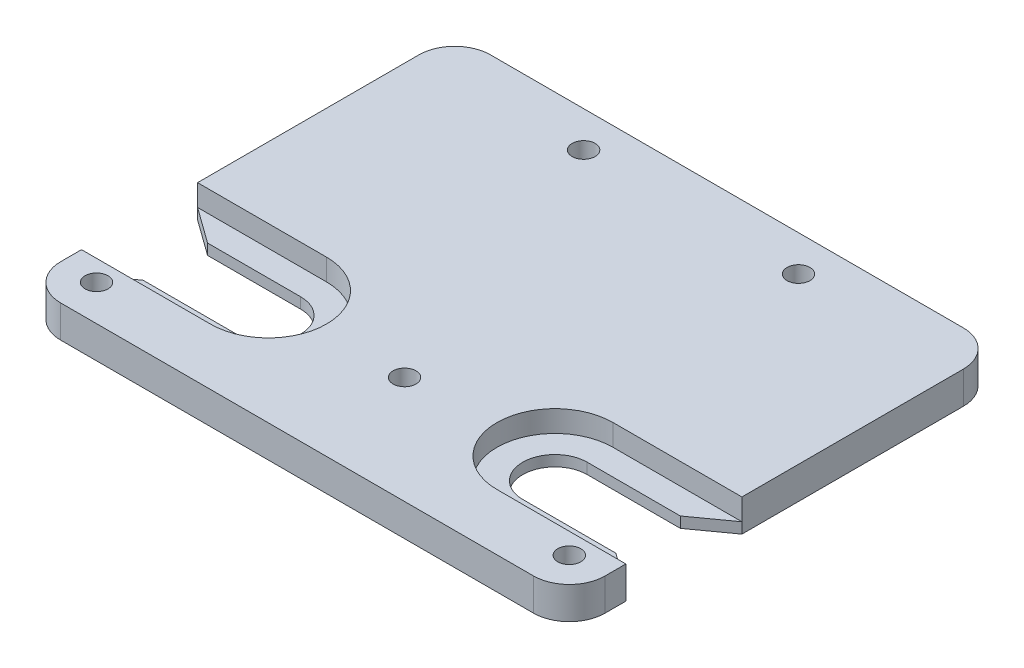
ISO-10303-21;
HEADER;
FILE_DESCRIPTION(('STEP AP214'),'2;1');
FILE_NAME('part.step','',(''),(''),'','','');
FILE_SCHEMA(('AUTOMOTIVE_DESIGN { 1 0 10303 214 1 1 1 1 }'));
ENDSEC;
DATA;
#1=APPLICATION_CONTEXT('core data for automotive mechanical design processes');
#2=APPLICATION_PROTOCOL_DEFINITION('international standard','automotive_design',2000,#1);
#3=PRODUCT_CONTEXT('',#1,'mechanical');
#4=PRODUCT('Part','Part','',(#3));
#5=PRODUCT_RELATED_PRODUCT_CATEGORY('part','',(#4));
#6=PRODUCT_DEFINITION_FORMATION('','',#4);
#7=PRODUCT_DEFINITION_CONTEXT('part definition',#1,'design');
#8=PRODUCT_DEFINITION('design','',#6,#7);
#9=PRODUCT_DEFINITION_SHAPE('','',#8);
#10=(LENGTH_UNIT() NAMED_UNIT(*) SI_UNIT(.MILLI.,.METRE.));
#11=(NAMED_UNIT(*) PLANE_ANGLE_UNIT() SI_UNIT($,.RADIAN.));
#12=(NAMED_UNIT(*) SI_UNIT($,.STERADIAN.) SOLID_ANGLE_UNIT());
#13=UNCERTAINTY_MEASURE_WITH_UNIT(LENGTH_MEASURE(1.E-05),#10,'distance_accuracy_value','');
#14=(GEOMETRIC_REPRESENTATION_CONTEXT(3) GLOBAL_UNCERTAINTY_ASSIGNED_CONTEXT((#13)) GLOBAL_UNIT_ASSIGNED_CONTEXT((#10,
#11,#12)) REPRESENTATION_CONTEXT('',''));
#15=CARTESIAN_POINT('',(0.,0.,0.));
#16=DIRECTION('',(0.,0.,1.));
#17=DIRECTION('',(1.,0.,0.));
#18=AXIS2_PLACEMENT_3D('',#15,#16,#17);
#19=CARTESIAN_POINT('',(-38.,4.5,30.));
#20=DIRECTION('',(1.,0.,0.));
#21=DIRECTION('',(0.,0.,-1.));
#22=AXIS2_PLACEMENT_3D('',#19,#20,#21);
#23=PLANE('',#22);
#24=DIRECTION('',(0.,0.,1.));
#25=VECTOR('',#24,1.);
#26=CARTESIAN_POINT('',(-38.,0.,30.));
#27=LINE('',#26,#25);
#28=CARTESIAN_POINT('',(-38.,0.,22.1));
#29=VERTEX_POINT('',#28);
#30=CARTESIAN_POINT('',(-38.,0.,25.));
#31=VERTEX_POINT('',#30);
#32=EDGE_CURVE('E384',#29,#31,#27,.T.);
#33=ORIENTED_EDGE('',*,*,#32,.T.);
#34=DIRECTION('',(0.,-1.,0.));
#35=VECTOR('',#34,1.);
#36=CARTESIAN_POINT('',(-38.,4.5,25.));
#37=LINE('',#36,#35);
#38=CARTESIAN_POINT('',(-38.,4.5,25.));
#39=VERTEX_POINT('',#38);
#40=EDGE_CURVE('E43',#31,#39,#37,.F.);
#41=ORIENTED_EDGE('',*,*,#40,.T.);
#42=DIRECTION('',(0.,0.,1.));
#43=VECTOR('',#42,1.);
#44=CARTESIAN_POINT('',(-38.,4.5,30.));
#45=LINE('',#44,#43);
#46=CARTESIAN_POINT('',(-38.,4.5,22.1));
#47=VERTEX_POINT('',#46);
#48=EDGE_CURVE('E373',#47,#39,#45,.T.);
#49=ORIENTED_EDGE('',*,*,#48,.F.);
#50=DIRECTION('',(0.,1.,0.));
#51=VECTOR('',#50,1.);
#52=CARTESIAN_POINT('',(-38.,-30.7188866985768,22.1));
#53=LINE('',#52,#51);
#54=CARTESIAN_POINT('',(-38.,1.5,22.1));
#55=VERTEX_POINT('',#54);
#56=EDGE_CURVE('E273',#55,#47,#53,.T.);
#57=ORIENTED_EDGE('',*,*,#56,.F.);
#58=DIRECTION('',(0.,1.,0.));
#59=VECTOR('',#58,1.);
#60=CARTESIAN_POINT('',(-38.,0.,22.1));
#61=LINE('',#60,#59);
#62=EDGE_CURVE('E264',#29,#55,#61,.T.);
#63=ORIENTED_EDGE('',*,*,#62,.F.);
#64=EDGE_LOOP('',(#33,#41,#49,#57,#63));
#65=FACE_BOUND('',#64,.T.);
#66=ADVANCED_FACE('F35',(#65),#23,.F.);
#67=CARTESIAN_POINT('',(-38.,4.5,-25.));
#68=VERTEX_POINT('',#67);
#69=CARTESIAN_POINT('',(-38.,4.5,5.90000000000001));
#70=VERTEX_POINT('',#69);
#71=EDGE_CURVE('E374',#68,#70,#45,.T.);
#72=ORIENTED_EDGE('',*,*,#71,.F.);
#73=DIRECTION('',(0.,-1.,0.));
#74=VECTOR('',#73,1.);
#75=CARTESIAN_POINT('',(-38.,4.5,-25.));
#76=LINE('',#75,#74);
#77=CARTESIAN_POINT('',(-38.,0.,-25.));
#78=VERTEX_POINT('',#77);
#79=EDGE_CURVE('E378',#68,#78,#76,.T.);
#80=ORIENTED_EDGE('',*,*,#79,.T.);
#81=CARTESIAN_POINT('',(-38.,0.,5.90000000000001));
#82=VERTEX_POINT('',#81);
#83=EDGE_CURVE('E385',#78,#82,#27,.T.);
#84=ORIENTED_EDGE('',*,*,#83,.T.);
#85=DIRECTION('',(0.,1.,0.));
#86=VECTOR('',#85,1.);
#87=CARTESIAN_POINT('',(-38.,0.,5.90000000000001));
#88=LINE('',#87,#86);
#89=CARTESIAN_POINT('',(-38.,1.5,5.90000000000001));
#90=VERTEX_POINT('',#89);
#91=EDGE_CURVE('E266',#82,#90,#88,.T.);
#92=ORIENTED_EDGE('',*,*,#91,.T.);
#93=DIRECTION('',(0.,1.,0.));
#94=VECTOR('',#93,1.);
#95=CARTESIAN_POINT('',(-38.,-30.7188866985768,5.90000000000001));
#96=LINE('',#95,#94);
#97=EDGE_CURVE('E279',#90,#70,#96,.T.);
#98=ORIENTED_EDGE('',*,*,#97,.T.);
#99=EDGE_LOOP('',(#72,#80,#84,#92,#98));
#100=FACE_BOUND('',#99,.T.);
#101=ADVANCED_FACE('F483',(#100),#23,.F.);
#102=CARTESIAN_POINT('',(0.,0.,0.));
#103=DIRECTION('',(0.,-1.,0.));
#104=DIRECTION('',(0.,0.,-1.));
#105=AXIS2_PLACEMENT_3D('',#102,#103,#104);
#106=PLANE('',#105);
#107=CARTESIAN_POINT('',(0.,0.,15.));
#108=DIRECTION('',(0.,1.,0.));
#109=DIRECTION('',(0.,0.,1.));
#110=AXIS2_PLACEMENT_3D('',#107,#108,#109);
#111=CIRCLE('',#110,1.6);
#112=CARTESIAN_POINT('',(0.,0.,16.6));
#113=VERTEX_POINT('',#112);
#114=EDGE_CURVE('E562',#113,#113,#111,.T.);
#115=ORIENTED_EDGE('',*,*,#114,.T.);
#116=EDGE_LOOP('',(#115));
#117=FACE_BOUND('',#116,.T.);
#118=CARTESIAN_POINT('',(-33.,0.,25.));
#119=DIRECTION('',(0.,1.,0.));
#120=DIRECTION('',(0.,0.,1.));
#121=AXIS2_PLACEMENT_3D('',#118,#119,#120);
#122=CIRCLE('',#121,1.6);
#123=CARTESIAN_POINT('',(-33.,0.,26.6));
#124=VERTEX_POINT('',#123);
#125=EDGE_CURVE('E571',#124,#124,#122,.T.);
#126=ORIENTED_EDGE('',*,*,#125,.T.);
#127=EDGE_LOOP('',(#126));
#128=FACE_BOUND('',#127,.T.);
#129=CARTESIAN_POINT('',(33.,0.,25.));
#130=DIRECTION('',(0.,1.,0.));
#131=DIRECTION('',(0.,0.,1.));
#132=AXIS2_PLACEMENT_3D('',#129,#130,#131);
#133=CIRCLE('',#132,1.6);
#134=CARTESIAN_POINT('',(33.,0.,26.6));
#135=VERTEX_POINT('',#134);
#136=EDGE_CURVE('E577',#135,#135,#133,.T.);
#137=ORIENTED_EDGE('',*,*,#136,.T.);
#138=EDGE_LOOP('',(#137));
#139=FACE_BOUND('',#138,.T.);
#140=CARTESIAN_POINT('',(15.,0.,-25.));
#141=DIRECTION('',(0.,1.,0.));
#142=DIRECTION('',(0.,0.,1.));
#143=AXIS2_PLACEMENT_3D('',#140,#141,#142);
#144=CIRCLE('',#143,1.6);
#145=CARTESIAN_POINT('',(15.,0.,-23.4));
#146=VERTEX_POINT('',#145);
#147=EDGE_CURVE('E583',#146,#146,#144,.T.);
#148=ORIENTED_EDGE('',*,*,#147,.T.);
#149=EDGE_LOOP('',(#148));
#150=FACE_BOUND('',#149,.T.);
#151=CARTESIAN_POINT('',(-15.,0.,-25.));
#152=DIRECTION('',(0.,1.,0.));
#153=DIRECTION('',(0.,0.,1.));
#154=AXIS2_PLACEMENT_3D('',#151,#152,#153);
#155=CIRCLE('',#154,1.6);
#156=CARTESIAN_POINT('',(-15.,0.,-23.4));
#157=VERTEX_POINT('',#156);
#158=EDGE_CURVE('E252',#157,#157,#155,.T.);
#159=ORIENTED_EDGE('',*,*,#158,.T.);
#160=EDGE_LOOP('',(#159));
#161=FACE_BOUND('',#160,.T.);
#162=ORIENTED_EDGE('',*,*,#83,.F.);
#163=CARTESIAN_POINT('',(-33.,0.,-25.));
#164=DIRECTION('',(0.,-1.,0.));
#165=DIRECTION('',(0.,0.,-1.));
#166=AXIS2_PLACEMENT_3D('',#163,#164,#165);
#167=CIRCLE('',#166,5.);
#168=CARTESIAN_POINT('',(-33.,0.,-30.));
#169=VERTEX_POINT('',#168);
#170=EDGE_CURVE('E398',#78,#169,#167,.T.);
#171=ORIENTED_EDGE('',*,*,#170,.T.);
#172=DIRECTION('',(-1.,0.,0.));
#173=VECTOR('',#172,1.);
#174=CARTESIAN_POINT('',(-38.,0.,-30.));
#175=LINE('',#174,#173);
#176=CARTESIAN_POINT('',(33.,0.,-30.));
#177=VERTEX_POINT('',#176);
#178=EDGE_CURVE('E381',#177,#169,#175,.T.);
#179=ORIENTED_EDGE('',*,*,#178,.F.);
#180=CARTESIAN_POINT('',(33.,0.,-25.));
#181=DIRECTION('',(0.,-1.,0.));
#182=DIRECTION('',(0.,0.,-1.));
#183=AXIS2_PLACEMENT_3D('',#180,#181,#182);
#184=CIRCLE('',#183,5.);
#185=CARTESIAN_POINT('',(38.,0.,-25.));
#186=VERTEX_POINT('',#185);
#187=EDGE_CURVE('E396',#177,#186,#184,.T.);
#188=ORIENTED_EDGE('',*,*,#187,.T.);
#189=DIRECTION('',(0.,0.,-1.));
#190=VECTOR('',#189,1.);
#191=CARTESIAN_POINT('',(38.,0.,30.));
#192=LINE('',#191,#190);
#193=CARTESIAN_POINT('',(38.,0.,5.90000000000001));
#194=VERTEX_POINT('',#193);
#195=EDGE_CURVE('E366',#194,#186,#192,.T.);
#196=ORIENTED_EDGE('',*,*,#195,.F.);
#197=DIRECTION('',(-0.811534341451494,0.,0.584304725845076));
#198=VECTOR('',#197,1.);
#199=CARTESIAN_POINT('',(33.,0.,9.50000000000001));
#200=LINE('',#199,#198);
#201=CARTESIAN_POINT('',(33.,0.,9.50000000000001));
#202=VERTEX_POINT('',#201);
#203=EDGE_CURVE('E308',#194,#202,#200,.T.);
#204=ORIENTED_EDGE('',*,*,#203,.T.);
#205=DIRECTION('',(-1.,0.,0.));
#206=VECTOR('',#205,1.);
#207=CARTESIAN_POINT('',(20.,0.,9.50000000000001));
#208=LINE('',#207,#206);
#209=CARTESIAN_POINT('',(20.,0.,9.50000000000001));
#210=VERTEX_POINT('',#209);
#211=EDGE_CURVE('E311',#202,#210,#208,.T.);
#212=ORIENTED_EDGE('',*,*,#211,.T.);
#213=CARTESIAN_POINT('',(20.,0.,14.));
#214=DIRECTION('',(0.,1.,0.));
#215=DIRECTION('',(0.,0.,1.));
#216=AXIS2_PLACEMENT_3D('',#213,#214,#215);
#217=CIRCLE('',#216,4.5);
#218=CARTESIAN_POINT('',(20.,0.,18.5));
#219=VERTEX_POINT('',#218);
#220=EDGE_CURVE('E298',#210,#219,#217,.T.);
#221=ORIENTED_EDGE('',*,*,#220,.T.);
#222=DIRECTION('',(1.,0.,0.));
#223=VECTOR('',#222,1.);
#224=CARTESIAN_POINT('',(33.,0.,18.5));
#225=LINE('',#224,#223);
#226=CARTESIAN_POINT('',(33.,0.,18.5));
#227=VERTEX_POINT('',#226);
#228=EDGE_CURVE('E301',#219,#227,#225,.T.);
#229=ORIENTED_EDGE('',*,*,#228,.T.);
#230=DIRECTION('',(0.811534341451494,0.,0.584304725845076));
#231=VECTOR('',#230,1.);
#232=CARTESIAN_POINT('',(38.,0.,22.1));
#233=LINE('',#232,#231);
#234=CARTESIAN_POINT('',(38.,0.,22.1));
#235=VERTEX_POINT('',#234);
#236=EDGE_CURVE('E305',#227,#235,#233,.T.);
#237=ORIENTED_EDGE('',*,*,#236,.T.);
#238=CARTESIAN_POINT('',(38.,0.,25.));
#239=VERTEX_POINT('',#238);
#240=EDGE_CURVE('E379',#239,#235,#192,.T.);
#241=ORIENTED_EDGE('',*,*,#240,.F.);
#242=CARTESIAN_POINT('',(33.,0.,25.));
#243=DIRECTION('',(0.,-1.,0.));
#244=DIRECTION('',(0.,0.,-1.));
#245=AXIS2_PLACEMENT_3D('',#242,#243,#244);
#246=CIRCLE('',#245,5.);
#247=CARTESIAN_POINT('',(33.,0.,30.));
#248=VERTEX_POINT('',#247);
#249=EDGE_CURVE('E392',#239,#248,#246,.T.);
#250=ORIENTED_EDGE('',*,*,#249,.T.);
#251=DIRECTION('',(1.,0.,0.));
#252=VECTOR('',#251,1.);
#253=CARTESIAN_POINT('',(-38.,0.,30.));
#254=LINE('',#253,#252);
#255=CARTESIAN_POINT('',(-33.,0.,30.));
#256=VERTEX_POINT('',#255);
#257=EDGE_CURVE('E387',#256,#248,#254,.T.);
#258=ORIENTED_EDGE('',*,*,#257,.F.);
#259=CARTESIAN_POINT('',(-33.,0.,25.));
#260=DIRECTION('',(0.,-1.,0.));
#261=DIRECTION('',(0.,0.,-1.));
#262=AXIS2_PLACEMENT_3D('',#259,#260,#261);
#263=CIRCLE('',#262,5.);
#264=EDGE_CURVE('E394',#256,#31,#263,.T.);
#265=ORIENTED_EDGE('',*,*,#264,.T.);
#266=ORIENTED_EDGE('',*,*,#32,.F.);
#267=DIRECTION('',(-0.811534341451494,0.,0.584304725845076));
#268=VECTOR('',#267,1.);
#269=CARTESIAN_POINT('',(-38.,0.,22.1));
#270=LINE('',#269,#268);
#271=CARTESIAN_POINT('',(-33.,0.,18.5));
#272=VERTEX_POINT('',#271);
#273=EDGE_CURVE('E247',#272,#29,#270,.T.);
#274=ORIENTED_EDGE('',*,*,#273,.F.);
#275=DIRECTION('',(-1.,0.,0.));
#276=VECTOR('',#275,1.);
#277=CARTESIAN_POINT('',(-33.,0.,18.5));
#278=LINE('',#277,#276);
#279=CARTESIAN_POINT('',(-20.,0.,18.5));
#280=VERTEX_POINT('',#279);
#281=EDGE_CURVE('E231',#280,#272,#278,.T.);
#282=ORIENTED_EDGE('',*,*,#281,.F.);
#283=CARTESIAN_POINT('',(-20.,0.,14.));
#284=DIRECTION('',(0.,-1.,0.));
#285=DIRECTION('',(0.,0.,1.));
#286=AXIS2_PLACEMENT_3D('',#283,#284,#285);
#287=CIRCLE('',#286,4.5);
#288=CARTESIAN_POINT('',(-20.,0.,9.50000000000001));
#289=VERTEX_POINT('',#288);
#290=EDGE_CURVE('E223',#289,#280,#287,.T.);
#291=ORIENTED_EDGE('',*,*,#290,.F.);
#292=DIRECTION('',(1.,0.,0.));
#293=VECTOR('',#292,1.);
#294=CARTESIAN_POINT('',(-20.,0.,9.50000000000001));
#295=LINE('',#294,#293);
#296=CARTESIAN_POINT('',(-33.,0.,9.50000000000001));
#297=VERTEX_POINT('',#296);
#298=EDGE_CURVE('E212',#297,#289,#295,.T.);
#299=ORIENTED_EDGE('',*,*,#298,.F.);
#300=DIRECTION('',(0.811534341451494,0.,0.584304725845076));
#301=VECTOR('',#300,1.);
#302=CARTESIAN_POINT('',(-33.,0.,9.50000000000001));
#303=LINE('',#302,#301);
#304=EDGE_CURVE('E222',#82,#297,#303,.T.);
#305=ORIENTED_EDGE('',*,*,#304,.F.);
#306=EDGE_LOOP('',(#162,#171,#179,#188,#196,#204,#212,#221,#229,#237,#241,#250,#258,#265,#266,
#274,#282,#291,#299,#305));
#307=FACE_BOUND('',#306,.T.);
#308=ADVANCED_FACE('F235',(#117,#128,#139,#150,#161,#307),#106,.T.);
#309=CARTESIAN_POINT('',(0.,1.5,0.));
#310=DIRECTION('',(0.,-1.,0.));
#311=DIRECTION('',(0.,0.,-1.));
#312=AXIS2_PLACEMENT_3D('',#309,#310,#311);
#313=PLANE('',#312);
#314=DIRECTION('',(-0.811534341451494,0.,0.584304725845076));
#315=VECTOR('',#314,1.);
#316=CARTESIAN_POINT('',(-38.,1.5,22.1));
#317=LINE('',#316,#315);
#318=CARTESIAN_POINT('',(-33.,1.5,18.5));
#319=VERTEX_POINT('',#318);
#320=EDGE_CURVE('E240',#319,#55,#317,.T.);
#321=ORIENTED_EDGE('',*,*,#320,.T.);
#322=DIRECTION('',(-1.,0.,0.));
#323=VECTOR('',#322,1.);
#324=CARTESIAN_POINT('',(-20.,1.5,22.1));
#325=LINE('',#324,#323);
#326=CARTESIAN_POINT('',(-20.,1.49999999999998,22.1));
#327=VERTEX_POINT('',#326);
#328=EDGE_CURVE('E283',#327,#55,#325,.T.);
#329=ORIENTED_EDGE('',*,*,#328,.F.);
#330=CARTESIAN_POINT('',(-20.,1.5,14.));
#331=DIRECTION('',(0.,-1.,0.));
#332=DIRECTION('',(0.,0.,-1.));
#333=AXIS2_PLACEMENT_3D('',#330,#331,#332);
#334=CIRCLE('',#333,8.1);
#335=CARTESIAN_POINT('',(-20.,1.5,5.90000000000001));
#336=VERTEX_POINT('',#335);
#337=EDGE_CURVE('E287',#336,#327,#334,.T.);
#338=ORIENTED_EDGE('',*,*,#337,.F.);
#339=DIRECTION('',(1.,0.,0.));
#340=VECTOR('',#339,1.);
#341=CARTESIAN_POINT('',(-20.,1.5,5.90000000000001));
#342=LINE('',#341,#340);
#343=EDGE_CURVE('E278',#90,#336,#342,.T.);
#344=ORIENTED_EDGE('',*,*,#343,.F.);
#345=DIRECTION('',(0.811534341451494,0.,0.584304725845076));
#346=VECTOR('',#345,1.);
#347=CARTESIAN_POINT('',(-33.,1.5,9.50000000000001));
#348=LINE('',#347,#346);
#349=CARTESIAN_POINT('',(-33.,1.5,9.50000000000001));
#350=VERTEX_POINT('',#349);
#351=EDGE_CURVE('E254',#90,#350,#348,.T.);
#352=ORIENTED_EDGE('',*,*,#351,.T.);
#353=DIRECTION('',(1.,0.,0.));
#354=VECTOR('',#353,1.);
#355=CARTESIAN_POINT('',(-20.,1.5,9.50000000000001));
#356=LINE('',#355,#354);
#357=CARTESIAN_POINT('',(-20.,1.5,9.50000000000001));
#358=VERTEX_POINT('',#357);
#359=EDGE_CURVE('E251',#350,#358,#356,.T.);
#360=ORIENTED_EDGE('',*,*,#359,.T.);
#361=CARTESIAN_POINT('',(-20.,1.5,14.));
#362=DIRECTION('',(0.,-1.,0.));
#363=DIRECTION('',(0.,0.,1.));
#364=AXIS2_PLACEMENT_3D('',#361,#362,#363);
#365=CIRCLE('',#364,4.5);
#366=CARTESIAN_POINT('',(-20.,1.5,18.5));
#367=VERTEX_POINT('',#366);
#368=EDGE_CURVE('E230',#358,#367,#365,.T.);
#369=ORIENTED_EDGE('',*,*,#368,.T.);
#370=DIRECTION('',(-1.,0.,0.));
#371=VECTOR('',#370,1.);
#372=CARTESIAN_POINT('',(-33.,1.5,18.5));
#373=LINE('',#372,#371);
#374=EDGE_CURVE('E237',#367,#319,#373,.T.);
#375=ORIENTED_EDGE('',*,*,#374,.T.);
#376=EDGE_LOOP('',(#321,#329,#338,#344,#352,#360,#369,#375));
#377=FACE_BOUND('',#376,.T.);
#378=ADVANCED_FACE('F491',(#377),#313,.F.);
#379=CARTESIAN_POINT('',(0.,4.5,0.));
#380=DIRECTION('',(0.,-1.,0.));
#381=DIRECTION('',(0.,0.,-1.));
#382=AXIS2_PLACEMENT_3D('',#379,#380,#381);
#383=PLANE('',#382);
#384=CARTESIAN_POINT('',(0.,4.5,15.));
#385=DIRECTION('',(0.,1.,0.));
#386=DIRECTION('',(0.,0.,1.));
#387=AXIS2_PLACEMENT_3D('',#384,#385,#386);
#388=CIRCLE('',#387,1.6);
#389=CARTESIAN_POINT('',(0.,4.5,16.6));
#390=VERTEX_POINT('',#389);
#391=EDGE_CURVE('E565',#390,#390,#388,.T.);
#392=ORIENTED_EDGE('',*,*,#391,.F.);
#393=EDGE_LOOP('',(#392));
#394=FACE_BOUND('',#393,.T.);
#395=CARTESIAN_POINT('',(-33.,4.5,25.));
#396=DIRECTION('',(0.,1.,0.));
#397=DIRECTION('',(0.,0.,1.));
#398=AXIS2_PLACEMENT_3D('',#395,#396,#397);
#399=CIRCLE('',#398,1.6);
#400=CARTESIAN_POINT('',(-33.,4.5,26.6));
#401=VERTEX_POINT('',#400);
#402=EDGE_CURVE('E568',#401,#401,#399,.T.);
#403=ORIENTED_EDGE('',*,*,#402,.F.);
#404=EDGE_LOOP('',(#403));
#405=FACE_BOUND('',#404,.T.);
#406=CARTESIAN_POINT('',(33.,4.5,25.));
#407=DIRECTION('',(0.,1.,0.));
#408=DIRECTION('',(0.,0.,1.));
#409=AXIS2_PLACEMENT_3D('',#406,#407,#408);
#410=CIRCLE('',#409,1.6);
#411=CARTESIAN_POINT('',(33.,4.5,26.6));
#412=VERTEX_POINT('',#411);
#413=EDGE_CURVE('E574',#412,#412,#410,.T.);
#414=ORIENTED_EDGE('',*,*,#413,.F.);
#415=EDGE_LOOP('',(#414));
#416=FACE_BOUND('',#415,.T.);
#417=CARTESIAN_POINT('',(15.,4.5,-25.));
#418=DIRECTION('',(0.,1.,0.));
#419=DIRECTION('',(0.,0.,1.));
#420=AXIS2_PLACEMENT_3D('',#417,#418,#419);
#421=CIRCLE('',#420,1.6);
#422=CARTESIAN_POINT('',(15.,4.5,-23.4));
#423=VERTEX_POINT('',#422);
#424=EDGE_CURVE('E580',#423,#423,#421,.T.);
#425=ORIENTED_EDGE('',*,*,#424,.F.);
#426=EDGE_LOOP('',(#425));
#427=FACE_BOUND('',#426,.T.);
#428=CARTESIAN_POINT('',(-15.,4.5,-25.));
#429=DIRECTION('',(0.,1.,0.));
#430=DIRECTION('',(0.,0.,1.));
#431=AXIS2_PLACEMENT_3D('',#428,#429,#430);
#432=CIRCLE('',#431,1.6);
#433=CARTESIAN_POINT('',(-15.,4.5,-23.4));
#434=VERTEX_POINT('',#433);
#435=EDGE_CURVE('E243',#434,#434,#432,.T.);
#436=ORIENTED_EDGE('',*,*,#435,.F.);
#437=EDGE_LOOP('',(#436));
#438=FACE_BOUND('',#437,.T.);
#439=DIRECTION('',(-1.,0.,0.));
#440=VECTOR('',#439,1.);
#441=CARTESIAN_POINT('',(-38.,4.5,-30.));
#442=LINE('',#441,#440);
#443=CARTESIAN_POINT('',(33.,4.5,-30.));
#444=VERTEX_POINT('',#443);
#445=CARTESIAN_POINT('',(-33.,4.5,-30.));
#446=VERTEX_POINT('',#445);
#447=EDGE_CURVE('E369',#444,#446,#442,.T.);
#448=ORIENTED_EDGE('',*,*,#447,.T.);
#449=CARTESIAN_POINT('',(-33.,4.5,-25.));
#450=DIRECTION('',(0.,-1.,0.));
#451=DIRECTION('',(0.,0.,-1.));
#452=AXIS2_PLACEMENT_3D('',#449,#450,#451);
#453=CIRCLE('',#452,5.);
#454=EDGE_CURVE('E410',#446,#68,#453,.F.);
#455=ORIENTED_EDGE('',*,*,#454,.T.);
#456=ORIENTED_EDGE('',*,*,#71,.T.);
#457=DIRECTION('',(1.,0.,0.));
#458=VECTOR('',#457,1.);
#459=CARTESIAN_POINT('',(-20.,4.5,5.90000000000001));
#460=LINE('',#459,#458);
#461=CARTESIAN_POINT('',(-20.,4.5,5.90000000000001));
#462=VERTEX_POINT('',#461);
#463=EDGE_CURVE('E275',#70,#462,#460,.T.);
#464=ORIENTED_EDGE('',*,*,#463,.T.);
#465=CARTESIAN_POINT('',(-20.,4.5,14.));
#466=DIRECTION('',(0.,-1.,0.));
#467=DIRECTION('',(0.,0.,1.));
#468=AXIS2_PLACEMENT_3D('',#465,#466,#467);
#469=CIRCLE('',#468,8.1);
#470=CARTESIAN_POINT('',(-20.,4.5,22.1));
#471=VERTEX_POINT('',#470);
#472=EDGE_CURVE('E280',#462,#471,#469,.T.);
#473=ORIENTED_EDGE('',*,*,#472,.T.);
#474=DIRECTION('',(-1.,0.,0.));
#475=VECTOR('',#474,1.);
#476=CARTESIAN_POINT('',(-20.,4.5,22.1));
#477=LINE('',#476,#475);
#478=EDGE_CURVE('E270',#471,#47,#477,.T.);
#479=ORIENTED_EDGE('',*,*,#478,.T.);
#480=ORIENTED_EDGE('',*,*,#48,.T.);
#481=CARTESIAN_POINT('',(-33.,4.5,25.));
#482=DIRECTION('',(0.,-1.,0.));
#483=DIRECTION('',(0.,0.,-1.));
#484=AXIS2_PLACEMENT_3D('',#481,#482,#483);
#485=CIRCLE('',#484,5.);
#486=CARTESIAN_POINT('',(-33.,4.5,30.));
#487=VERTEX_POINT('',#486);
#488=EDGE_CURVE('E406',#39,#487,#485,.F.);
#489=ORIENTED_EDGE('',*,*,#488,.T.);
#490=DIRECTION('',(1.,0.,0.));
#491=VECTOR('',#490,1.);
#492=CARTESIAN_POINT('',(-38.,4.5,30.));
#493=LINE('',#492,#491);
#494=CARTESIAN_POINT('',(33.,4.5,30.));
#495=VERTEX_POINT('',#494);
#496=EDGE_CURVE('E376',#487,#495,#493,.T.);
#497=ORIENTED_EDGE('',*,*,#496,.T.);
#498=CARTESIAN_POINT('',(33.,4.5,25.));
#499=DIRECTION('',(0.,-1.,0.));
#500=DIRECTION('',(0.,0.,-1.));
#501=AXIS2_PLACEMENT_3D('',#498,#499,#500);
#502=CIRCLE('',#501,5.);
#503=CARTESIAN_POINT('',(38.,4.5,25.));
#504=VERTEX_POINT('',#503);
#505=EDGE_CURVE('E58',#495,#504,#502,.F.);
#506=ORIENTED_EDGE('',*,*,#505,.T.);
#507=DIRECTION('',(0.,0.,-1.));
#508=VECTOR('',#507,1.);
#509=CARTESIAN_POINT('',(38.,4.5,30.));
#510=LINE('',#509,#508);
#511=CARTESIAN_POINT('',(38.,4.5,22.1));
#512=VERTEX_POINT('',#511);
#513=EDGE_CURVE('E367',#504,#512,#510,.T.);
#514=ORIENTED_EDGE('',*,*,#513,.T.);
#515=DIRECTION('',(1.,0.,0.));
#516=VECTOR('',#515,1.);
#517=CARTESIAN_POINT('',(20.,4.5,22.1));
#518=LINE('',#517,#516);
#519=CARTESIAN_POINT('',(20.,4.5,22.1));
#520=VERTEX_POINT('',#519);
#521=EDGE_CURVE('E343',#520,#512,#518,.T.);
#522=ORIENTED_EDGE('',*,*,#521,.F.);
#523=CARTESIAN_POINT('',(20.,4.5,14.));
#524=DIRECTION('',(0.,1.,0.));
#525=DIRECTION('',(0.,0.,1.));
#526=AXIS2_PLACEMENT_3D('',#523,#524,#525);
#527=CIRCLE('',#526,8.1);
#528=CARTESIAN_POINT('',(20.,4.5,5.90000000000001));
#529=VERTEX_POINT('',#528);
#530=EDGE_CURVE('E328',#529,#520,#527,.T.);
#531=ORIENTED_EDGE('',*,*,#530,.F.);
#532=DIRECTION('',(-1.,0.,0.));
#533=VECTOR('',#532,1.);
#534=CARTESIAN_POINT('',(20.,4.5,5.90000000000001));
#535=LINE('',#534,#533);
#536=CARTESIAN_POINT('',(38.,4.5,5.90000000000001));
#537=VERTEX_POINT('',#536);
#538=EDGE_CURVE('E340',#537,#529,#535,.T.);
#539=ORIENTED_EDGE('',*,*,#538,.F.);
#540=CARTESIAN_POINT('',(38.,4.5,-25.));
#541=VERTEX_POINT('',#540);
#542=EDGE_CURVE('E370',#537,#541,#510,.T.);
#543=ORIENTED_EDGE('',*,*,#542,.T.);
#544=CARTESIAN_POINT('',(33.,4.5,-25.));
#545=DIRECTION('',(0.,-1.,0.));
#546=DIRECTION('',(0.,0.,-1.));
#547=AXIS2_PLACEMENT_3D('',#544,#545,#546);
#548=CIRCLE('',#547,5.);
#549=EDGE_CURVE('E408',#541,#444,#548,.F.);
#550=ORIENTED_EDGE('',*,*,#549,.T.);
#551=EDGE_LOOP('',(#448,#455,#456,#464,#473,#479,#480,#489,#497,#506,#514,#522,#531,#539,#543,#550));
#552=FACE_BOUND('',#551,.T.);
#553=ADVANCED_FACE('F427',(#394,#405,#416,#427,#438,#552),#383,.F.);
#554=CARTESIAN_POINT('',(38.,4.5,30.));
#555=DIRECTION('',(-1.,0.,0.));
#556=DIRECTION('',(0.,0.,1.));
#557=AXIS2_PLACEMENT_3D('',#554,#555,#556);
#558=PLANE('',#557);
#559=ORIENTED_EDGE('',*,*,#195,.T.);
#560=DIRECTION('',(0.,-1.,0.));
#561=VECTOR('',#560,1.);
#562=CARTESIAN_POINT('',(38.,4.5,-25.));
#563=LINE('',#562,#561);
#564=EDGE_CURVE('E50',#186,#541,#563,.F.);
#565=ORIENTED_EDGE('',*,*,#564,.T.);
#566=ORIENTED_EDGE('',*,*,#542,.F.);
#567=DIRECTION('',(0.,1.,0.));
#568=VECTOR('',#567,1.);
#569=CARTESIAN_POINT('',(38.,-30.7188866985768,5.90000000000001));
#570=LINE('',#569,#568);
#571=CARTESIAN_POINT('',(38.,1.5,5.90000000000001));
#572=VERTEX_POINT('',#571);
#573=EDGE_CURVE('E359',#572,#537,#570,.T.);
#574=ORIENTED_EDGE('',*,*,#573,.F.);
#575=DIRECTION('',(0.,1.,0.));
#576=VECTOR('',#575,1.);
#577=CARTESIAN_POINT('',(38.,0.,5.90000000000001));
#578=LINE('',#577,#576);
#579=EDGE_CURVE('E331',#194,#572,#578,.T.);
#580=ORIENTED_EDGE('',*,*,#579,.F.);
#581=EDGE_LOOP('',(#559,#565,#566,#574,#580));
#582=FACE_BOUND('',#581,.T.);
#583=ADVANCED_FACE('F455',(#582),#558,.F.);
#584=ORIENTED_EDGE('',*,*,#513,.F.);
#585=DIRECTION('',(0.,-1.,0.));
#586=VECTOR('',#585,1.);
#587=CARTESIAN_POINT('',(38.,4.5,25.));
#588=LINE('',#587,#586);
#589=EDGE_CURVE('E12',#504,#239,#588,.T.);
#590=ORIENTED_EDGE('',*,*,#589,.T.);
#591=ORIENTED_EDGE('',*,*,#240,.T.);
#592=DIRECTION('',(0.,1.,0.));
#593=VECTOR('',#592,1.);
#594=CARTESIAN_POINT('',(38.,0.,22.1));
#595=LINE('',#594,#593);
#596=CARTESIAN_POINT('',(38.,1.5,22.1));
#597=VERTEX_POINT('',#596);
#598=EDGE_CURVE('E333',#235,#597,#595,.T.);
#599=ORIENTED_EDGE('',*,*,#598,.T.);
#600=DIRECTION('',(0.,1.,0.));
#601=VECTOR('',#600,1.);
#602=CARTESIAN_POINT('',(38.,-30.7188866985768,22.1));
#603=LINE('',#602,#601);
#604=EDGE_CURVE('E350',#597,#512,#603,.T.);
#605=ORIENTED_EDGE('',*,*,#604,.T.);
#606=EDGE_LOOP('',(#584,#590,#591,#599,#605));
#607=FACE_BOUND('',#606,.T.);
#608=ADVANCED_FACE('F440',(#607),#558,.F.);
#609=CARTESIAN_POINT('',(-38.,4.5,-30.));
#610=DIRECTION('',(0.,0.,1.));
#611=DIRECTION('',(1.,0.,0.));
#612=AXIS2_PLACEMENT_3D('',#609,#610,#611);
#613=PLANE('',#612);
#614=ORIENTED_EDGE('',*,*,#178,.T.);
#615=DIRECTION('',(0.,-1.,0.));
#616=VECTOR('',#615,1.);
#617=CARTESIAN_POINT('',(-33.,4.5,-30.));
#618=LINE('',#617,#616);
#619=EDGE_CURVE('E403',#169,#446,#618,.F.);
#620=ORIENTED_EDGE('',*,*,#619,.T.);
#621=ORIENTED_EDGE('',*,*,#447,.F.);
#622=DIRECTION('',(0.,-1.,0.));
#623=VECTOR('',#622,1.);
#624=CARTESIAN_POINT('',(33.,4.5,-30.));
#625=LINE('',#624,#623);
#626=EDGE_CURVE('E400',#444,#177,#625,.T.);
#627=ORIENTED_EDGE('',*,*,#626,.T.);
#628=EDGE_LOOP('',(#614,#620,#621,#627));
#629=FACE_BOUND('',#628,.T.);
#630=ADVANCED_FACE('F475',(#629),#613,.F.);
#631=CARTESIAN_POINT('',(-38.,4.5,30.));
#632=DIRECTION('',(0.,0.,-1.));
#633=DIRECTION('',(-1.,0.,0.));
#634=AXIS2_PLACEMENT_3D('',#631,#632,#633);
#635=PLANE('',#634);
#636=ORIENTED_EDGE('',*,*,#496,.F.);
#637=DIRECTION('',(0.,-1.,0.));
#638=VECTOR('',#637,1.);
#639=CARTESIAN_POINT('',(-33.,4.5,30.));
#640=LINE('',#639,#638);
#641=EDGE_CURVE('E415',#487,#256,#640,.T.);
#642=ORIENTED_EDGE('',*,*,#641,.T.);
#643=ORIENTED_EDGE('',*,*,#257,.T.);
#644=DIRECTION('',(0.,-1.,0.));
#645=VECTOR('',#644,1.);
#646=CARTESIAN_POINT('',(33.,4.5,30.));
#647=LINE('',#646,#645);
#648=EDGE_CURVE('E413',#248,#495,#647,.F.);
#649=ORIENTED_EDGE('',*,*,#648,.T.);
#650=EDGE_LOOP('',(#636,#642,#643,#649));
#651=FACE_BOUND('',#650,.T.);
#652=ADVANCED_FACE('F434',(#651),#635,.F.);
#653=CARTESIAN_POINT('',(0.,1.5,0.));
#654=DIRECTION('',(0.,-1.,0.));
#655=DIRECTION('',(0.,0.,-1.));
#656=AXIS2_PLACEMENT_3D('',#653,#654,#655);
#657=PLANE('',#656);
#658=DIRECTION('',(-1.,0.,0.));
#659=VECTOR('',#658,1.);
#660=CARTESIAN_POINT('',(20.,1.5,9.50000000000001));
#661=LINE('',#660,#659);
#662=CARTESIAN_POINT('',(33.,1.5,9.50000000000001));
#663=VERTEX_POINT('',#662);
#664=CARTESIAN_POINT('',(20.,1.5,9.50000000000001));
#665=VERTEX_POINT('',#664);
#666=EDGE_CURVE('E302',#663,#665,#661,.T.);
#667=ORIENTED_EDGE('',*,*,#666,.F.);
#668=DIRECTION('',(-0.811534341451494,0.,0.584304725845076));
#669=VECTOR('',#668,1.);
#670=CARTESIAN_POINT('',(33.,1.5,9.50000000000001));
#671=LINE('',#670,#669);
#672=EDGE_CURVE('E321',#572,#663,#671,.T.);
#673=ORIENTED_EDGE('',*,*,#672,.F.);
#674=DIRECTION('',(-1.,0.,0.));
#675=VECTOR('',#674,1.);
#676=CARTESIAN_POINT('',(20.,1.5,5.90000000000001));
#677=LINE('',#676,#675);
#678=CARTESIAN_POINT('',(20.,1.5,5.90000000000001));
#679=VERTEX_POINT('',#678);
#680=EDGE_CURVE('E356',#572,#679,#677,.T.);
#681=ORIENTED_EDGE('',*,*,#680,.T.);
#682=CARTESIAN_POINT('',(20.,1.5,14.));
#683=DIRECTION('',(0.,-1.,0.));
#684=DIRECTION('',(0.,0.,-1.));
#685=AXIS2_PLACEMENT_3D('',#682,#683,#684);
#686=CIRCLE('',#685,8.1);
#687=CARTESIAN_POINT('',(20.,1.5,22.1));
#688=VERTEX_POINT('',#687);
#689=EDGE_CURVE('E351',#679,#688,#686,.F.);
#690=ORIENTED_EDGE('',*,*,#689,.T.);
#691=DIRECTION('',(1.,0.,0.));
#692=VECTOR('',#691,1.);
#693=CARTESIAN_POINT('',(20.,1.5,22.1));
#694=LINE('',#693,#692);
#695=EDGE_CURVE('E342',#688,#597,#694,.T.);
#696=ORIENTED_EDGE('',*,*,#695,.T.);
#697=DIRECTION('',(0.811534341451494,0.,0.584304725845076));
#698=VECTOR('',#697,1.);
#699=CARTESIAN_POINT('',(38.,1.5,22.1));
#700=LINE('',#699,#698);
#701=CARTESIAN_POINT('',(33.,1.5,18.5));
#702=VERTEX_POINT('',#701);
#703=EDGE_CURVE('E319',#702,#597,#700,.T.);
#704=ORIENTED_EDGE('',*,*,#703,.F.);
#705=DIRECTION('',(1.,0.,0.));
#706=VECTOR('',#705,1.);
#707=CARTESIAN_POINT('',(33.,1.5,18.5));
#708=LINE('',#707,#706);
#709=CARTESIAN_POINT('',(20.,1.5,18.5));
#710=VERTEX_POINT('',#709);
#711=EDGE_CURVE('E316',#710,#702,#708,.T.);
#712=ORIENTED_EDGE('',*,*,#711,.F.);
#713=CARTESIAN_POINT('',(20.,1.5,14.));
#714=DIRECTION('',(0.,1.,0.));
#715=DIRECTION('',(0.,0.,1.));
#716=AXIS2_PLACEMENT_3D('',#713,#714,#715);
#717=CIRCLE('',#716,4.5);
#718=EDGE_CURVE('E286',#665,#710,#717,.T.);
#719=ORIENTED_EDGE('',*,*,#718,.F.);
#720=EDGE_LOOP('',(#667,#673,#681,#690,#696,#704,#712,#719));
#721=FACE_BOUND('',#720,.T.);
#722=ADVANCED_FACE('F463',(#721),#657,.F.);
#723=CARTESIAN_POINT('',(20.,-30.7188866985768,22.1));
#724=DIRECTION('',(0.,0.,1.));
#725=DIRECTION('',(1.,0.,0.));
#726=AXIS2_PLACEMENT_3D('',#723,#724,#725);
#727=PLANE('',#726);
#728=DIRECTION('',(0.,1.,0.));
#729=VECTOR('',#728,1.);
#730=CARTESIAN_POINT('',(20.,-30.7188866985768,22.1));
#731=LINE('',#730,#729);
#732=EDGE_CURVE('E354',#688,#520,#731,.T.);
#733=ORIENTED_EDGE('',*,*,#732,.T.);
#734=ORIENTED_EDGE('',*,*,#521,.T.);
#735=ORIENTED_EDGE('',*,*,#604,.F.);
#736=ORIENTED_EDGE('',*,*,#695,.F.);
#737=EDGE_LOOP('',(#733,#734,#735,#736));
#738=FACE_BOUND('',#737,.T.);
#739=ADVANCED_FACE('F446',(#738),#727,.F.);
#740=CARTESIAN_POINT('',(20.,-30.7188866985768,5.90000000000001));
#741=DIRECTION('',(0.,0.,-1.));
#742=DIRECTION('',(-1.,0.,0.));
#743=AXIS2_PLACEMENT_3D('',#740,#741,#742);
#744=PLANE('',#743);
#745=ORIENTED_EDGE('',*,*,#573,.T.);
#746=ORIENTED_EDGE('',*,*,#538,.T.);
#747=DIRECTION('',(0.,1.,0.));
#748=VECTOR('',#747,1.);
#749=CARTESIAN_POINT('',(20.,-30.7188866985768,5.90000000000001));
#750=LINE('',#749,#748);
#751=EDGE_CURVE('E355',#679,#529,#750,.T.);
#752=ORIENTED_EDGE('',*,*,#751,.F.);
#753=ORIENTED_EDGE('',*,*,#680,.F.);
#754=EDGE_LOOP('',(#745,#746,#752,#753));
#755=FACE_BOUND('',#754,.T.);
#756=ADVANCED_FACE('F459',(#755),#744,.F.);
#757=CARTESIAN_POINT('',(20.,-30.7188866985768,14.));
#758=DIRECTION('',(0.,1.,0.));
#759=DIRECTION('',(0.,0.,1.));
#760=AXIS2_PLACEMENT_3D('',#757,#758,#759);
#761=CYLINDRICAL_SURFACE('',#760,8.1);
#762=ORIENTED_EDGE('',*,*,#751,.T.);
#763=ORIENTED_EDGE('',*,*,#530,.T.);
#764=ORIENTED_EDGE('',*,*,#732,.F.);
#765=ORIENTED_EDGE('',*,*,#689,.F.);
#766=EDGE_LOOP('',(#762,#763,#764,#765));
#767=FACE_BOUND('',#766,.T.);
#768=ADVANCED_FACE('F449',(#767),#761,.F.);
#769=CARTESIAN_POINT('',(20.,0.,14.));
#770=DIRECTION('',(0.,1.,0.));
#771=DIRECTION('',(0.,0.,1.));
#772=AXIS2_PLACEMENT_3D('',#769,#770,#771);
#773=CYLINDRICAL_SURFACE('',#772,4.5);
#774=ORIENTED_EDGE('',*,*,#718,.T.);
#775=DIRECTION('',(0.,1.,0.));
#776=VECTOR('',#775,1.);
#777=CARTESIAN_POINT('',(20.,0.,18.5));
#778=LINE('',#777,#776);
#779=EDGE_CURVE('E314',#219,#710,#778,.T.);
#780=ORIENTED_EDGE('',*,*,#779,.F.);
#781=ORIENTED_EDGE('',*,*,#220,.F.);
#782=DIRECTION('',(0.,1.,0.));
#783=VECTOR('',#782,1.);
#784=CARTESIAN_POINT('',(20.,0.,9.50000000000001));
#785=LINE('',#784,#783);
#786=EDGE_CURVE('E326',#210,#665,#785,.T.);
#787=ORIENTED_EDGE('',*,*,#786,.T.);
#788=EDGE_LOOP('',(#774,#780,#781,#787));
#789=FACE_BOUND('',#788,.T.);
#790=ADVANCED_FACE('F805',(#789),#773,.F.);
#791=CARTESIAN_POINT('',(20.,0.,9.50000000000001));
#792=DIRECTION('',(0.,0.,-1.));
#793=DIRECTION('',(-1.,0.,0.));
#794=AXIS2_PLACEMENT_3D('',#791,#792,#793);
#795=PLANE('',#794);
#796=ORIENTED_EDGE('',*,*,#666,.T.);
#797=ORIENTED_EDGE('',*,*,#786,.F.);
#798=ORIENTED_EDGE('',*,*,#211,.F.);
#799=DIRECTION('',(0.,1.,0.));
#800=VECTOR('',#799,1.);
#801=CARTESIAN_POINT('',(33.,0.,9.50000000000001));
#802=LINE('',#801,#800);
#803=EDGE_CURVE('E329',#202,#663,#802,.T.);
#804=ORIENTED_EDGE('',*,*,#803,.T.);
#805=EDGE_LOOP('',(#796,#797,#798,#804));
#806=FACE_BOUND('',#805,.T.);
#807=ADVANCED_FACE('F798',(#806),#795,.F.);
#808=CARTESIAN_POINT('',(33.,0.,9.50000000000001));
#809=DIRECTION('',(-0.584304725845076,0.,-0.811534341451494));
#810=DIRECTION('',(-0.811534341451495,0.,0.584304725845076));
#811=AXIS2_PLACEMENT_3D('',#808,#809,#810);
#812=PLANE('',#811);
#813=ORIENTED_EDGE('',*,*,#672,.T.);
#814=ORIENTED_EDGE('',*,*,#803,.F.);
#815=ORIENTED_EDGE('',*,*,#203,.F.);
#816=ORIENTED_EDGE('',*,*,#579,.T.);
#817=EDGE_LOOP('',(#813,#814,#815,#816));
#818=FACE_BOUND('',#817,.T.);
#819=ADVANCED_FACE('F466',(#818),#812,.F.);
#820=CARTESIAN_POINT('',(38.,0.,22.1));
#821=DIRECTION('',(-0.584304725845076,0.,0.811534341451494));
#822=DIRECTION('',(0.811534341451495,0.,0.584304725845076));
#823=AXIS2_PLACEMENT_3D('',#820,#821,#822);
#824=PLANE('',#823);
#825=ORIENTED_EDGE('',*,*,#703,.T.);
#826=ORIENTED_EDGE('',*,*,#598,.F.);
#827=ORIENTED_EDGE('',*,*,#236,.F.);
#828=DIRECTION('',(0.,1.,0.));
#829=VECTOR('',#828,1.);
#830=CARTESIAN_POINT('',(33.,0.,18.5));
#831=LINE('',#830,#829);
#832=EDGE_CURVE('E336',#227,#702,#831,.T.);
#833=ORIENTED_EDGE('',*,*,#832,.T.);
#834=EDGE_LOOP('',(#825,#826,#827,#833));
#835=FACE_BOUND('',#834,.T.);
#836=ADVANCED_FACE('F783',(#835),#824,.F.);
#837=CARTESIAN_POINT('',(33.,0.,18.5));
#838=DIRECTION('',(0.,0.,1.));
#839=DIRECTION('',(1.,0.,0.));
#840=AXIS2_PLACEMENT_3D('',#837,#838,#839);
#841=PLANE('',#840);
#842=ORIENTED_EDGE('',*,*,#711,.T.);
#843=ORIENTED_EDGE('',*,*,#832,.F.);
#844=ORIENTED_EDGE('',*,*,#228,.F.);
#845=ORIENTED_EDGE('',*,*,#779,.T.);
#846=EDGE_LOOP('',(#842,#843,#844,#845));
#847=FACE_BOUND('',#846,.T.);
#848=ADVANCED_FACE('F633',(#847),#841,.F.);
#849=CARTESIAN_POINT('',(-20.,-30.7188866985768,14.));
#850=DIRECTION('',(0.,1.,0.));
#851=DIRECTION('',(0.,0.,1.));
#852=AXIS2_PLACEMENT_3D('',#849,#850,#851);
#853=CYLINDRICAL_SURFACE('',#852,8.1);
#854=ORIENTED_EDGE('',*,*,#337,.T.);
#855=DIRECTION('',(0.,1.,0.));
#856=VECTOR('',#855,1.);
#857=CARTESIAN_POINT('',(-20.,-30.7188866985768,22.1));
#858=LINE('',#857,#856);
#859=EDGE_CURVE('E274',#327,#471,#858,.T.);
#860=ORIENTED_EDGE('',*,*,#859,.T.);
#861=ORIENTED_EDGE('',*,*,#472,.F.);
#862=DIRECTION('',(0.,1.,0.));
#863=VECTOR('',#862,1.);
#864=CARTESIAN_POINT('',(-20.,-30.7188866985768,5.90000000000001));
#865=LINE('',#864,#863);
#866=EDGE_CURVE('E261',#336,#462,#865,.T.);
#867=ORIENTED_EDGE('',*,*,#866,.F.);
#868=EDGE_LOOP('',(#854,#860,#861,#867));
#869=FACE_BOUND('',#868,.T.);
#870=ADVANCED_FACE('F494',(#869),#853,.F.);
#871=CARTESIAN_POINT('',(-20.,-30.7188866985768,22.1));
#872=DIRECTION('',(0.,0.,-1.));
#873=DIRECTION('',(-1.,0.,0.));
#874=AXIS2_PLACEMENT_3D('',#871,#872,#873);
#875=PLANE('',#874);
#876=ORIENTED_EDGE('',*,*,#328,.T.);
#877=ORIENTED_EDGE('',*,*,#56,.T.);
#878=ORIENTED_EDGE('',*,*,#478,.F.);
#879=ORIENTED_EDGE('',*,*,#859,.F.);
#880=EDGE_LOOP('',(#876,#877,#878,#879));
#881=FACE_BOUND('',#880,.T.);
#882=ADVANCED_FACE('F496',(#881),#875,.T.);
#883=CARTESIAN_POINT('',(-20.,-30.7188866985768,5.90000000000001));
#884=DIRECTION('',(0.,0.,1.));
#885=DIRECTION('',(1.,0.,0.));
#886=AXIS2_PLACEMENT_3D('',#883,#884,#885);
#887=PLANE('',#886);
#888=ORIENTED_EDGE('',*,*,#343,.T.);
#889=ORIENTED_EDGE('',*,*,#866,.T.);
#890=ORIENTED_EDGE('',*,*,#463,.F.);
#891=ORIENTED_EDGE('',*,*,#97,.F.);
#892=EDGE_LOOP('',(#888,#889,#890,#891));
#893=FACE_BOUND('',#892,.T.);
#894=ADVANCED_FACE('F488',(#893),#887,.T.);
#895=CARTESIAN_POINT('',(-20.,0.,14.));
#896=DIRECTION('',(0.,1.,0.));
#897=DIRECTION('',(0.,0.,1.));
#898=AXIS2_PLACEMENT_3D('',#895,#896,#897);
#899=CYLINDRICAL_SURFACE('',#898,4.5);
#900=ORIENTED_EDGE('',*,*,#368,.F.);
#901=DIRECTION('',(0.,1.,0.));
#902=VECTOR('',#901,1.);
#903=CARTESIAN_POINT('',(-20.,0.,9.50000000000001));
#904=LINE('',#903,#902);
#905=EDGE_CURVE('E216',#289,#358,#904,.T.);
#906=ORIENTED_EDGE('',*,*,#905,.F.);
#907=ORIENTED_EDGE('',*,*,#290,.T.);
#908=DIRECTION('',(0.,1.,0.));
#909=VECTOR('',#908,1.);
#910=CARTESIAN_POINT('',(-20.,0.,18.5));
#911=LINE('',#910,#909);
#912=EDGE_CURVE('E259',#280,#367,#911,.T.);
#913=ORIENTED_EDGE('',*,*,#912,.T.);
#914=EDGE_LOOP('',(#900,#906,#907,#913));
#915=FACE_BOUND('',#914,.T.);
#916=ADVANCED_FACE('F226',(#915),#899,.F.);
#917=CARTESIAN_POINT('',(-33.,0.,18.5));
#918=DIRECTION('',(0.,0.,-1.));
#919=DIRECTION('',(-1.,0.,0.));
#920=AXIS2_PLACEMENT_3D('',#917,#918,#919);
#921=PLANE('',#920);
#922=ORIENTED_EDGE('',*,*,#374,.F.);
#923=ORIENTED_EDGE('',*,*,#912,.F.);
#924=ORIENTED_EDGE('',*,*,#281,.T.);
#925=DIRECTION('',(0.,1.,0.));
#926=VECTOR('',#925,1.);
#927=CARTESIAN_POINT('',(-33.,0.,18.5));
#928=LINE('',#927,#926);
#929=EDGE_CURVE('E262',#272,#319,#928,.T.);
#930=ORIENTED_EDGE('',*,*,#929,.T.);
#931=EDGE_LOOP('',(#922,#923,#924,#930));
#932=FACE_BOUND('',#931,.T.);
#933=ADVANCED_FACE('F502',(#932),#921,.T.);
#934=CARTESIAN_POINT('',(-38.,0.,22.1));
#935=DIRECTION('',(-0.584304725845076,0.,-0.811534341451494));
#936=DIRECTION('',(-0.811534341451495,0.,0.584304725845076));
#937=AXIS2_PLACEMENT_3D('',#934,#935,#936);
#938=PLANE('',#937);
#939=ORIENTED_EDGE('',*,*,#320,.F.);
#940=ORIENTED_EDGE('',*,*,#929,.F.);
#941=ORIENTED_EDGE('',*,*,#273,.T.);
#942=ORIENTED_EDGE('',*,*,#62,.T.);
#943=EDGE_LOOP('',(#939,#940,#941,#942));
#944=FACE_BOUND('',#943,.T.);
#945=ADVANCED_FACE('F500',(#944),#938,.T.);
#946=CARTESIAN_POINT('',(-33.,0.,9.50000000000001));
#947=DIRECTION('',(-0.584304725845076,0.,0.811534341451494));
#948=DIRECTION('',(0.811534341451495,0.,0.584304725845076));
#949=AXIS2_PLACEMENT_3D('',#946,#947,#948);
#950=PLANE('',#949);
#951=ORIENTED_EDGE('',*,*,#351,.F.);
#952=ORIENTED_EDGE('',*,*,#91,.F.);
#953=ORIENTED_EDGE('',*,*,#304,.T.);
#954=DIRECTION('',(0.,1.,0.));
#955=VECTOR('',#954,1.);
#956=CARTESIAN_POINT('',(-33.,0.,9.50000000000001));
#957=LINE('',#956,#955);
#958=EDGE_CURVE('E218',#297,#350,#957,.T.);
#959=ORIENTED_EDGE('',*,*,#958,.T.);
#960=EDGE_LOOP('',(#951,#952,#953,#959));
#961=FACE_BOUND('',#960,.T.);
#962=ADVANCED_FACE('F509',(#961),#950,.T.);
#963=CARTESIAN_POINT('',(-20.,0.,9.50000000000001));
#964=DIRECTION('',(0.,0.,1.));
#965=DIRECTION('',(1.,0.,0.));
#966=AXIS2_PLACEMENT_3D('',#963,#964,#965);
#967=PLANE('',#966);
#968=ORIENTED_EDGE('',*,*,#359,.F.);
#969=ORIENTED_EDGE('',*,*,#958,.F.);
#970=ORIENTED_EDGE('',*,*,#298,.T.);
#971=ORIENTED_EDGE('',*,*,#905,.T.);
#972=EDGE_LOOP('',(#968,#969,#970,#971));
#973=FACE_BOUND('',#972,.T.);
#974=ADVANCED_FACE('F215',(#973),#967,.T.);
#975=CARTESIAN_POINT('',(-33.,4.5,-25.));
#976=DIRECTION('',(0.,-1.,0.));
#977=DIRECTION('',(0.,0.,-1.));
#978=AXIS2_PLACEMENT_3D('',#975,#976,#977);
#979=CYLINDRICAL_SURFACE('',#978,5.);
#980=ORIENTED_EDGE('',*,*,#454,.F.);
#981=ORIENTED_EDGE('',*,*,#619,.F.);
#982=ORIENTED_EDGE('',*,*,#170,.F.);
#983=ORIENTED_EDGE('',*,*,#79,.F.);
#984=EDGE_LOOP('',(#980,#981,#982,#983));
#985=FACE_BOUND('',#984,.T.);
#986=ADVANCED_FACE('F478',(#985),#979,.T.);
#987=CARTESIAN_POINT('',(33.,4.5,-25.));
#988=DIRECTION('',(0.,-1.,0.));
#989=DIRECTION('',(0.,0.,-1.));
#990=AXIS2_PLACEMENT_3D('',#987,#988,#989);
#991=CYLINDRICAL_SURFACE('',#990,5.);
#992=ORIENTED_EDGE('',*,*,#549,.F.);
#993=ORIENTED_EDGE('',*,*,#564,.F.);
#994=ORIENTED_EDGE('',*,*,#187,.F.);
#995=ORIENTED_EDGE('',*,*,#626,.F.);
#996=EDGE_LOOP('',(#992,#993,#994,#995));
#997=FACE_BOUND('',#996,.T.);
#998=ADVANCED_FACE('F470',(#997),#991,.T.);
#999=CARTESIAN_POINT('',(-33.,4.5,25.));
#1000=DIRECTION('',(0.,-1.,0.));
#1001=DIRECTION('',(0.,0.,-1.));
#1002=AXIS2_PLACEMENT_3D('',#999,#1000,#1001);
#1003=CYLINDRICAL_SURFACE('',#1002,5.);
#1004=ORIENTED_EDGE('',*,*,#488,.F.);
#1005=ORIENTED_EDGE('',*,*,#40,.F.);
#1006=ORIENTED_EDGE('',*,*,#264,.F.);
#1007=ORIENTED_EDGE('',*,*,#641,.F.);
#1008=EDGE_LOOP('',(#1004,#1005,#1006,#1007));
#1009=FACE_BOUND('',#1008,.T.);
#1010=ADVANCED_FACE('F431',(#1009),#1003,.T.);
#1011=CARTESIAN_POINT('',(33.,4.5,25.));
#1012=DIRECTION('',(0.,-1.,0.));
#1013=DIRECTION('',(0.,0.,-1.));
#1014=AXIS2_PLACEMENT_3D('',#1011,#1012,#1013);
#1015=CYLINDRICAL_SURFACE('',#1014,5.);
#1016=ORIENTED_EDGE('',*,*,#505,.F.);
#1017=ORIENTED_EDGE('',*,*,#648,.F.);
#1018=ORIENTED_EDGE('',*,*,#249,.F.);
#1019=ORIENTED_EDGE('',*,*,#589,.F.);
#1020=EDGE_LOOP('',(#1016,#1017,#1018,#1019));
#1021=FACE_BOUND('',#1020,.T.);
#1022=ADVANCED_FACE('F37',(#1021),#1015,.T.);
#1023=CARTESIAN_POINT('',(-15.,0.,-25.));
#1024=DIRECTION('',(0.,1.,0.));
#1025=DIRECTION('',(0.,0.,1.));
#1026=AXIS2_PLACEMENT_3D('',#1023,#1024,#1025);
#1027=CYLINDRICAL_SURFACE('',#1026,1.6);
#1028=ORIENTED_EDGE('',*,*,#158,.F.);
#1029=EDGE_LOOP('',(#1028));
#1030=FACE_BOUND('',#1029,.T.);
#1031=ORIENTED_EDGE('',*,*,#435,.T.);
#1032=EDGE_LOOP('',(#1031));
#1033=FACE_BOUND('',#1032,.T.);
#1034=ADVANCED_FACE('F532',(#1030,#1033),#1027,.F.);
#1035=CARTESIAN_POINT('',(15.,0.,-25.));
#1036=DIRECTION('',(0.,1.,0.));
#1037=DIRECTION('',(0.,0.,1.));
#1038=AXIS2_PLACEMENT_3D('',#1035,#1036,#1037);
#1039=CYLINDRICAL_SURFACE('',#1038,1.6);
#1040=ORIENTED_EDGE('',*,*,#147,.F.);
#1041=EDGE_LOOP('',(#1040));
#1042=FACE_BOUND('',#1041,.T.);
#1043=ORIENTED_EDGE('',*,*,#424,.T.);
#1044=EDGE_LOOP('',(#1043));
#1045=FACE_BOUND('',#1044,.T.);
#1046=ADVANCED_FACE('F536',(#1042,#1045),#1039,.F.);
#1047=CARTESIAN_POINT('',(33.,0.,25.));
#1048=DIRECTION('',(0.,1.,0.));
#1049=DIRECTION('',(0.,0.,1.));
#1050=AXIS2_PLACEMENT_3D('',#1047,#1048,#1049);
#1051=CYLINDRICAL_SURFACE('',#1050,1.6);
#1052=ORIENTED_EDGE('',*,*,#136,.F.);
#1053=EDGE_LOOP('',(#1052));
#1054=FACE_BOUND('',#1053,.T.);
#1055=ORIENTED_EDGE('',*,*,#413,.T.);
#1056=EDGE_LOOP('',(#1055));
#1057=FACE_BOUND('',#1056,.T.);
#1058=ADVANCED_FACE('F541',(#1054,#1057),#1051,.F.);
#1059=CARTESIAN_POINT('',(-33.,0.,25.));
#1060=DIRECTION('',(0.,1.,0.));
#1061=DIRECTION('',(0.,0.,1.));
#1062=AXIS2_PLACEMENT_3D('',#1059,#1060,#1061);
#1063=CYLINDRICAL_SURFACE('',#1062,1.6);
#1064=ORIENTED_EDGE('',*,*,#125,.F.);
#1065=EDGE_LOOP('',(#1064));
#1066=FACE_BOUND('',#1065,.T.);
#1067=ORIENTED_EDGE('',*,*,#402,.T.);
#1068=EDGE_LOOP('',(#1067));
#1069=FACE_BOUND('',#1068,.T.);
#1070=ADVANCED_FACE('F549',(#1066,#1069),#1063,.F.);
#1071=CARTESIAN_POINT('',(0.,0.,15.));
#1072=DIRECTION('',(0.,1.,0.));
#1073=DIRECTION('',(0.,0.,1.));
#1074=AXIS2_PLACEMENT_3D('',#1071,#1072,#1073);
#1075=CYLINDRICAL_SURFACE('',#1074,1.6);
#1076=ORIENTED_EDGE('',*,*,#114,.F.);
#1077=EDGE_LOOP('',(#1076));
#1078=FACE_BOUND('',#1077,.T.);
#1079=ORIENTED_EDGE('',*,*,#391,.T.);
#1080=EDGE_LOOP('',(#1079));
#1081=FACE_BOUND('',#1080,.T.);
#1082=ADVANCED_FACE('F553',(#1078,#1081),#1075,.F.);
#1083=CLOSED_SHELL('',(#66,#101,#308,#378,#553,#583,#608,#630,#652,#722,#739,#756,#768,#790,
#807,#819,#836,#848,#870,#882,#894,#916,#933,#945,#962,#974,#986,#998,#1010,#1022,#1034,#1046,
#1058,#1070,#1082));
#1084=MANIFOLD_SOLID_BREP('B2',#1083);
#1085=ADVANCED_BREP_SHAPE_REPRESENTATION('',(#18,#1084),#14);
#1086=SHAPE_DEFINITION_REPRESENTATION(#9,#1085);
ENDSEC;
END-ISO-10303-21;
